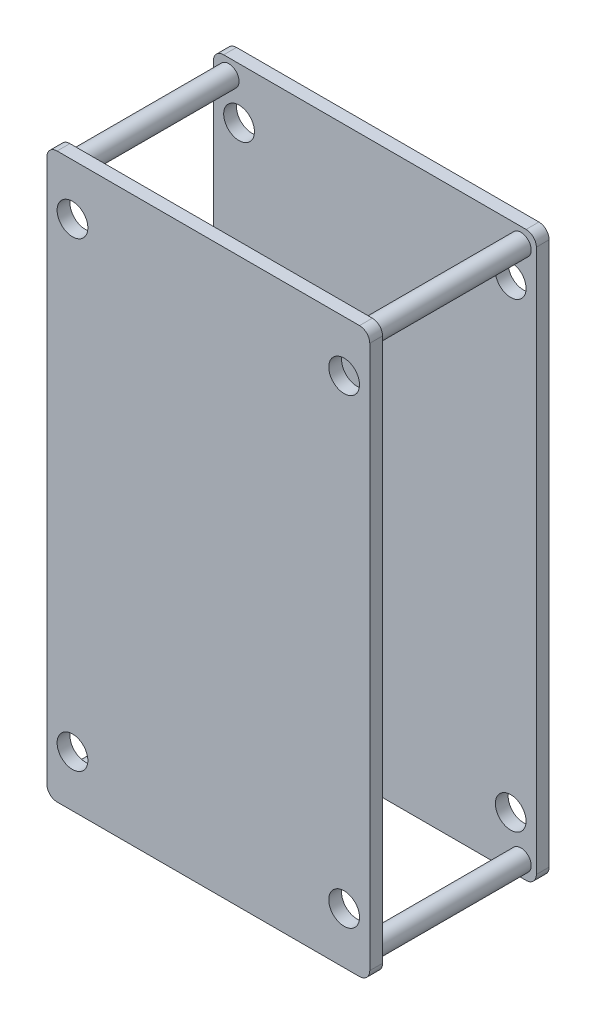
ISO-10303-21;
HEADER;
FILE_DESCRIPTION(('STEP AP214'),'2;1');
FILE_NAME('part.step','',(''),(''),'','','');
FILE_SCHEMA(('AUTOMOTIVE_DESIGN { 1 0 10303 214 1 1 1 1 }'));
ENDSEC;
DATA;
#1=APPLICATION_CONTEXT('core data for automotive mechanical design processes');
#2=APPLICATION_PROTOCOL_DEFINITION('international standard','automotive_design',2000,#1);
#3=PRODUCT_CONTEXT('',#1,'mechanical');
#4=PRODUCT('Part','Part','',(#3));
#5=PRODUCT_RELATED_PRODUCT_CATEGORY('part','',(#4));
#6=PRODUCT_DEFINITION_FORMATION('','',#4);
#7=PRODUCT_DEFINITION_CONTEXT('part definition',#1,'design');
#8=PRODUCT_DEFINITION('design','',#6,#7);
#9=PRODUCT_DEFINITION_SHAPE('','',#8);
#10=(LENGTH_UNIT() NAMED_UNIT(*) SI_UNIT(.MILLI.,.METRE.));
#11=(NAMED_UNIT(*) PLANE_ANGLE_UNIT() SI_UNIT($,.RADIAN.));
#12=(NAMED_UNIT(*) SI_UNIT($,.STERADIAN.) SOLID_ANGLE_UNIT());
#13=UNCERTAINTY_MEASURE_WITH_UNIT(LENGTH_MEASURE(1.E-05),#10,'distance_accuracy_value','');
#14=(GEOMETRIC_REPRESENTATION_CONTEXT(3) GLOBAL_UNCERTAINTY_ASSIGNED_CONTEXT((#13)) GLOBAL_UNIT_ASSIGNED_CONTEXT((#10,
#11,#12)) REPRESENTATION_CONTEXT('',''));
#15=CARTESIAN_POINT('',(0.,0.,0.));
#16=DIRECTION('',(0.,0.,1.));
#17=DIRECTION('',(1.,0.,0.));
#18=AXIS2_PLACEMENT_3D('',#15,#16,#17);
#19=CARTESIAN_POINT('',(-29.5,53.,35.));
#20=DIRECTION('',(0.,0.,1.));
#21=DIRECTION('',(1.,0.,0.));
#22=AXIS2_PLACEMENT_3D('',#19,#20,#21);
#23=CYLINDRICAL_SURFACE('',#22,2.);
#24=DIRECTION('',(0.,0.,1.));
#25=VECTOR('',#24,1.);
#26=CARTESIAN_POINT('',(-29.5,55.,35.));
#27=LINE('',#26,#25);
#28=CARTESIAN_POINT('',(-29.5,55.,32.5));
#29=VERTEX_POINT('',#28);
#30=CARTESIAN_POINT('',(-29.5,55.,35.));
#31=VERTEX_POINT('',#30);
#32=EDGE_CURVE('E261',#29,#31,#27,.T.);
#33=ORIENTED_EDGE('',*,*,#32,.F.);
#34=CARTESIAN_POINT('',(-29.5,53.,32.5));
#35=DIRECTION('',(0.,0.,-1.));
#36=DIRECTION('',(-1.,0.,0.));
#37=AXIS2_PLACEMENT_3D('',#34,#35,#36);
#38=CIRCLE('',#37,2.);
#39=CARTESIAN_POINT('',(-31.5,53.,32.5));
#40=VERTEX_POINT('',#39);
#41=EDGE_CURVE('E40',#40,#29,#38,.T.);
#42=ORIENTED_EDGE('',*,*,#41,.F.);
#43=DIRECTION('',(0.,0.,1.));
#44=VECTOR('',#43,1.);
#45=CARTESIAN_POINT('',(-31.5,53.,35.));
#46=LINE('',#45,#44);
#47=CARTESIAN_POINT('',(-31.5,53.,35.));
#48=VERTEX_POINT('',#47);
#49=EDGE_CURVE('E264',#48,#40,#46,.F.);
#50=ORIENTED_EDGE('',*,*,#49,.F.);
#51=CARTESIAN_POINT('',(-29.5,53.,35.));
#52=DIRECTION('',(0.,0.,-1.));
#53=DIRECTION('',(-1.,0.,0.));
#54=AXIS2_PLACEMENT_3D('',#51,#52,#53);
#55=CIRCLE('',#54,2.);
#56=EDGE_CURVE('E11',#31,#48,#55,.F.);
#57=ORIENTED_EDGE('',*,*,#56,.F.);
#58=EDGE_LOOP('',(#33,#42,#50,#57));
#59=FACE_BOUND('',#58,.T.);
#60=ADVANCED_FACE('F33',(#59),#23,.T.);
#61=CARTESIAN_POINT('',(-29.5,-53.,35.));
#62=DIRECTION('',(0.,0.,-1.));
#63=DIRECTION('',(-1.,0.,0.));
#64=AXIS2_PLACEMENT_3D('',#61,#62,#63);
#65=CYLINDRICAL_SURFACE('',#64,2.);
#66=DIRECTION('',(0.,0.,-1.));
#67=VECTOR('',#66,1.);
#68=CARTESIAN_POINT('',(-29.5,-55.,35.));
#69=LINE('',#68,#67);
#70=CARTESIAN_POINT('',(-29.5,-55.,35.));
#71=VERTEX_POINT('',#70);
#72=CARTESIAN_POINT('',(-29.5,-55.,32.5));
#73=VERTEX_POINT('',#72);
#74=EDGE_CURVE('E250',#71,#73,#69,.T.);
#75=ORIENTED_EDGE('',*,*,#74,.F.);
#76=CARTESIAN_POINT('',(-29.5,-53.,35.));
#77=DIRECTION('',(0.,0.,-1.));
#78=DIRECTION('',(-1.,0.,0.));
#79=AXIS2_PLACEMENT_3D('',#76,#77,#78);
#80=CIRCLE('',#79,2.);
#81=CARTESIAN_POINT('',(-31.5,-53.,35.));
#82=VERTEX_POINT('',#81);
#83=EDGE_CURVE('E256',#82,#71,#80,.F.);
#84=ORIENTED_EDGE('',*,*,#83,.F.);
#85=DIRECTION('',(0.,0.,-1.));
#86=VECTOR('',#85,1.);
#87=CARTESIAN_POINT('',(-31.5,-53.,35.));
#88=LINE('',#87,#86);
#89=CARTESIAN_POINT('',(-31.5,-53.,32.5));
#90=VERTEX_POINT('',#89);
#91=EDGE_CURVE('E253',#90,#82,#88,.F.);
#92=ORIENTED_EDGE('',*,*,#91,.F.);
#93=CARTESIAN_POINT('',(-29.5,-53.,32.5));
#94=DIRECTION('',(0.,0.,-1.));
#95=DIRECTION('',(-1.,0.,0.));
#96=AXIS2_PLACEMENT_3D('',#93,#94,#95);
#97=CIRCLE('',#96,2.);
#98=EDGE_CURVE('E258',#73,#90,#97,.T.);
#99=ORIENTED_EDGE('',*,*,#98,.F.);
#100=EDGE_LOOP('',(#75,#84,#92,#99));
#101=FACE_BOUND('',#100,.T.);
#102=ADVANCED_FACE('F358',(#101),#65,.T.);
#103=CARTESIAN_POINT('',(29.5,-53.,35.));
#104=DIRECTION('',(0.,0.,-1.));
#105=DIRECTION('',(-1.,0.,0.));
#106=AXIS2_PLACEMENT_3D('',#103,#104,#105);
#107=CYLINDRICAL_SURFACE('',#106,2.);
#108=DIRECTION('',(0.,0.,-1.));
#109=VECTOR('',#108,1.);
#110=CARTESIAN_POINT('',(31.5,-53.,35.));
#111=LINE('',#110,#109);
#112=CARTESIAN_POINT('',(31.5,-53.,35.));
#113=VERTEX_POINT('',#112);
#114=CARTESIAN_POINT('',(31.5,-53.,32.5));
#115=VERTEX_POINT('',#114);
#116=EDGE_CURVE('E239',#113,#115,#111,.T.);
#117=ORIENTED_EDGE('',*,*,#116,.F.);
#118=CARTESIAN_POINT('',(29.5,-53.,35.));
#119=DIRECTION('',(0.,0.,-1.));
#120=DIRECTION('',(-1.,0.,0.));
#121=AXIS2_PLACEMENT_3D('',#118,#119,#120);
#122=CIRCLE('',#121,2.);
#123=CARTESIAN_POINT('',(29.5,-55.,35.));
#124=VERTEX_POINT('',#123);
#125=EDGE_CURVE('E245',#124,#113,#122,.F.);
#126=ORIENTED_EDGE('',*,*,#125,.F.);
#127=DIRECTION('',(0.,0.,-1.));
#128=VECTOR('',#127,1.);
#129=CARTESIAN_POINT('',(29.5,-55.,35.));
#130=LINE('',#129,#128);
#131=CARTESIAN_POINT('',(29.5,-55.,32.5));
#132=VERTEX_POINT('',#131);
#133=EDGE_CURVE('E242',#132,#124,#130,.F.);
#134=ORIENTED_EDGE('',*,*,#133,.F.);
#135=CARTESIAN_POINT('',(29.5,-53.,32.5));
#136=DIRECTION('',(0.,0.,-1.));
#137=DIRECTION('',(-1.,0.,0.));
#138=AXIS2_PLACEMENT_3D('',#135,#136,#137);
#139=CIRCLE('',#138,2.);
#140=EDGE_CURVE('E247',#115,#132,#139,.T.);
#141=ORIENTED_EDGE('',*,*,#140,.F.);
#142=EDGE_LOOP('',(#117,#126,#134,#141));
#143=FACE_BOUND('',#142,.T.);
#144=ADVANCED_FACE('F362',(#143),#107,.T.);
#145=CARTESIAN_POINT('',(29.5,53.,35.));
#146=DIRECTION('',(0.,0.,1.));
#147=DIRECTION('',(1.,0.,0.));
#148=AXIS2_PLACEMENT_3D('',#145,#146,#147);
#149=CYLINDRICAL_SURFACE('',#148,2.);
#150=DIRECTION('',(0.,0.,1.));
#151=VECTOR('',#150,1.);
#152=CARTESIAN_POINT('',(31.5,53.,35.));
#153=LINE('',#152,#151);
#154=CARTESIAN_POINT('',(31.5,53.,32.5));
#155=VERTEX_POINT('',#154);
#156=CARTESIAN_POINT('',(31.5,53.,35.));
#157=VERTEX_POINT('',#156);
#158=EDGE_CURVE('E228',#155,#157,#153,.T.);
#159=ORIENTED_EDGE('',*,*,#158,.F.);
#160=CARTESIAN_POINT('',(29.5,53.,32.5));
#161=DIRECTION('',(0.,0.,-1.));
#162=DIRECTION('',(-1.,0.,0.));
#163=AXIS2_PLACEMENT_3D('',#160,#161,#162);
#164=CIRCLE('',#163,2.);
#165=CARTESIAN_POINT('',(29.5,55.,32.5));
#166=VERTEX_POINT('',#165);
#167=EDGE_CURVE('E234',#166,#155,#164,.T.);
#168=ORIENTED_EDGE('',*,*,#167,.F.);
#169=DIRECTION('',(0.,0.,1.));
#170=VECTOR('',#169,1.);
#171=CARTESIAN_POINT('',(29.5,55.,35.));
#172=LINE('',#171,#170);
#173=CARTESIAN_POINT('',(29.5,55.,35.));
#174=VERTEX_POINT('',#173);
#175=EDGE_CURVE('E231',#174,#166,#172,.F.);
#176=ORIENTED_EDGE('',*,*,#175,.F.);
#177=CARTESIAN_POINT('',(29.5,53.,35.));
#178=DIRECTION('',(0.,0.,-1.));
#179=DIRECTION('',(-1.,0.,0.));
#180=AXIS2_PLACEMENT_3D('',#177,#178,#179);
#181=CIRCLE('',#180,2.);
#182=EDGE_CURVE('E237',#157,#174,#181,.F.);
#183=ORIENTED_EDGE('',*,*,#182,.F.);
#184=EDGE_LOOP('',(#159,#168,#176,#183));
#185=FACE_BOUND('',#184,.T.);
#186=ADVANCED_FACE('F367',(#185),#149,.T.);
#187=CARTESIAN_POINT('',(-29.5,-53.,2.5));
#188=DIRECTION('',(0.,0.,1.));
#189=DIRECTION('',(1.,0.,0.));
#190=AXIS2_PLACEMENT_3D('',#187,#188,#189);
#191=CYLINDRICAL_SURFACE('',#190,2.);
#192=DIRECTION('',(0.,0.,1.));
#193=VECTOR('',#192,1.);
#194=CARTESIAN_POINT('',(-31.5,-53.,2.5));
#195=LINE('',#194,#193);
#196=CARTESIAN_POINT('',(-31.5,-53.,0.));
#197=VERTEX_POINT('',#196);
#198=CARTESIAN_POINT('',(-31.5,-53.,2.5));
#199=VERTEX_POINT('',#198);
#200=EDGE_CURVE('E218',#197,#199,#195,.T.);
#201=ORIENTED_EDGE('',*,*,#200,.F.);
#202=CARTESIAN_POINT('',(-29.5,-53.,0.));
#203=DIRECTION('',(0.,0.,-1.));
#204=DIRECTION('',(-1.,0.,0.));
#205=AXIS2_PLACEMENT_3D('',#202,#203,#204);
#206=CIRCLE('',#205,2.);
#207=CARTESIAN_POINT('',(-29.5,-55.,0.));
#208=VERTEX_POINT('',#207);
#209=EDGE_CURVE('E224',#208,#197,#206,.T.);
#210=ORIENTED_EDGE('',*,*,#209,.F.);
#211=DIRECTION('',(0.,0.,1.));
#212=VECTOR('',#211,1.);
#213=CARTESIAN_POINT('',(-29.5,-55.,2.5));
#214=LINE('',#213,#212);
#215=CARTESIAN_POINT('',(-29.5,-55.,2.5));
#216=VERTEX_POINT('',#215);
#217=EDGE_CURVE('E221',#216,#208,#214,.F.);
#218=ORIENTED_EDGE('',*,*,#217,.F.);
#219=CARTESIAN_POINT('',(-29.5,-53.,2.5));
#220=DIRECTION('',(0.,0.,-1.));
#221=DIRECTION('',(-1.,0.,0.));
#222=AXIS2_PLACEMENT_3D('',#219,#220,#221);
#223=CIRCLE('',#222,2.);
#224=EDGE_CURVE('E226',#199,#216,#223,.F.);
#225=ORIENTED_EDGE('',*,*,#224,.F.);
#226=EDGE_LOOP('',(#201,#210,#218,#225));
#227=FACE_BOUND('',#226,.T.);
#228=ADVANCED_FACE('F336',(#227),#191,.T.);
#229=CARTESIAN_POINT('',(-29.5,53.,2.5));
#230=DIRECTION('',(0.,0.,1.));
#231=DIRECTION('',(1.,0.,0.));
#232=AXIS2_PLACEMENT_3D('',#229,#230,#231);
#233=CYLINDRICAL_SURFACE('',#232,2.);
#234=DIRECTION('',(0.,0.,1.));
#235=VECTOR('',#234,1.);
#236=CARTESIAN_POINT('',(-29.5,55.,2.5));
#237=LINE('',#236,#235);
#238=CARTESIAN_POINT('',(-29.5,55.,0.));
#239=VERTEX_POINT('',#238);
#240=CARTESIAN_POINT('',(-29.5,55.,2.5));
#241=VERTEX_POINT('',#240);
#242=EDGE_CURVE('E208',#239,#241,#237,.T.);
#243=ORIENTED_EDGE('',*,*,#242,.F.);
#244=CARTESIAN_POINT('',(-29.5,53.,0.));
#245=DIRECTION('',(0.,0.,-1.));
#246=DIRECTION('',(-1.,0.,0.));
#247=AXIS2_PLACEMENT_3D('',#244,#245,#246);
#248=CIRCLE('',#247,2.);
#249=CARTESIAN_POINT('',(-31.5,53.,0.));
#250=VERTEX_POINT('',#249);
#251=EDGE_CURVE('E214',#250,#239,#248,.T.);
#252=ORIENTED_EDGE('',*,*,#251,.F.);
#253=DIRECTION('',(0.,0.,1.));
#254=VECTOR('',#253,1.);
#255=CARTESIAN_POINT('',(-31.5,53.,2.5));
#256=LINE('',#255,#254);
#257=CARTESIAN_POINT('',(-31.5,53.,2.5));
#258=VERTEX_POINT('',#257);
#259=EDGE_CURVE('E211',#258,#250,#256,.F.);
#260=ORIENTED_EDGE('',*,*,#259,.F.);
#261=CARTESIAN_POINT('',(-29.5,53.,2.5));
#262=DIRECTION('',(0.,0.,-1.));
#263=DIRECTION('',(-1.,0.,0.));
#264=AXIS2_PLACEMENT_3D('',#261,#262,#263);
#265=CIRCLE('',#264,2.);
#266=EDGE_CURVE('E216',#241,#258,#265,.F.);
#267=ORIENTED_EDGE('',*,*,#266,.F.);
#268=EDGE_LOOP('',(#243,#252,#260,#267));
#269=FACE_BOUND('',#268,.T.);
#270=ADVANCED_FACE('F342',(#269),#233,.T.);
#271=CARTESIAN_POINT('',(29.5,53.,2.5));
#272=DIRECTION('',(0.,0.,1.));
#273=DIRECTION('',(1.,0.,0.));
#274=AXIS2_PLACEMENT_3D('',#271,#272,#273);
#275=CYLINDRICAL_SURFACE('',#274,2.);
#276=DIRECTION('',(0.,0.,1.));
#277=VECTOR('',#276,1.);
#278=CARTESIAN_POINT('',(31.5,53.,2.5));
#279=LINE('',#278,#277);
#280=CARTESIAN_POINT('',(31.5,53.,0.));
#281=VERTEX_POINT('',#280);
#282=CARTESIAN_POINT('',(31.5,53.,2.5));
#283=VERTEX_POINT('',#282);
#284=EDGE_CURVE('E154',#281,#283,#279,.T.);
#285=ORIENTED_EDGE('',*,*,#284,.F.);
#286=CARTESIAN_POINT('',(29.5,53.,0.));
#287=DIRECTION('',(0.,0.,-1.));
#288=DIRECTION('',(-1.,0.,0.));
#289=AXIS2_PLACEMENT_3D('',#286,#287,#288);
#290=CIRCLE('',#289,2.);
#291=CARTESIAN_POINT('',(29.5,55.,0.));
#292=VERTEX_POINT('',#291);
#293=EDGE_CURVE('E169',#292,#281,#290,.T.);
#294=ORIENTED_EDGE('',*,*,#293,.F.);
#295=DIRECTION('',(0.,0.,1.));
#296=VECTOR('',#295,1.);
#297=CARTESIAN_POINT('',(29.5,55.,2.5));
#298=LINE('',#297,#296);
#299=CARTESIAN_POINT('',(29.5,55.,2.5));
#300=VERTEX_POINT('',#299);
#301=EDGE_CURVE('E202',#300,#292,#298,.F.);
#302=ORIENTED_EDGE('',*,*,#301,.F.);
#303=CARTESIAN_POINT('',(29.5,53.,2.5));
#304=DIRECTION('',(0.,0.,-1.));
#305=DIRECTION('',(-1.,0.,0.));
#306=AXIS2_PLACEMENT_3D('',#303,#304,#305);
#307=CIRCLE('',#306,2.);
#308=EDGE_CURVE('E206',#283,#300,#307,.F.);
#309=ORIENTED_EDGE('',*,*,#308,.F.);
#310=EDGE_LOOP('',(#285,#294,#302,#309));
#311=FACE_BOUND('',#310,.T.);
#312=ADVANCED_FACE('F348',(#311),#275,.T.);
#313=CARTESIAN_POINT('',(29.5,-53.,2.5));
#314=DIRECTION('',(0.,0.,-1.));
#315=DIRECTION('',(-1.,0.,0.));
#316=AXIS2_PLACEMENT_3D('',#313,#314,#315);
#317=CYLINDRICAL_SURFACE('',#316,2.);
#318=DIRECTION('',(0.,0.,-1.));
#319=VECTOR('',#318,1.);
#320=CARTESIAN_POINT('',(31.5,-53.,2.5));
#321=LINE('',#320,#319);
#322=CARTESIAN_POINT('',(31.5,-53.,2.5));
#323=VERTEX_POINT('',#322);
#324=CARTESIAN_POINT('',(31.5,-53.,0.));
#325=VERTEX_POINT('',#324);
#326=EDGE_CURVE('E147',#323,#325,#321,.T.);
#327=ORIENTED_EDGE('',*,*,#326,.F.);
#328=CARTESIAN_POINT('',(29.5,-53.,2.5));
#329=DIRECTION('',(0.,0.,-1.));
#330=DIRECTION('',(-1.,0.,0.));
#331=AXIS2_PLACEMENT_3D('',#328,#329,#330);
#332=CIRCLE('',#331,2.);
#333=CARTESIAN_POINT('',(29.5,-55.,2.5));
#334=VERTEX_POINT('',#333);
#335=EDGE_CURVE('E155',#334,#323,#332,.F.);
#336=ORIENTED_EDGE('',*,*,#335,.F.);
#337=DIRECTION('',(0.,0.,-1.));
#338=VECTOR('',#337,1.);
#339=CARTESIAN_POINT('',(29.5,-55.,2.5));
#340=LINE('',#339,#338);
#341=CARTESIAN_POINT('',(29.5,-55.,0.));
#342=VERTEX_POINT('',#341);
#343=EDGE_CURVE('E150',#342,#334,#340,.F.);
#344=ORIENTED_EDGE('',*,*,#343,.F.);
#345=CARTESIAN_POINT('',(29.5,-53.,0.));
#346=DIRECTION('',(0.,0.,-1.));
#347=DIRECTION('',(-1.,0.,0.));
#348=AXIS2_PLACEMENT_3D('',#345,#346,#347);
#349=CIRCLE('',#348,2.);
#350=EDGE_CURVE('E143',#325,#342,#349,.T.);
#351=ORIENTED_EDGE('',*,*,#350,.F.);
#352=EDGE_LOOP('',(#327,#336,#344,#351));
#353=FACE_BOUND('',#352,.T.);
#354=ADVANCED_FACE('F145',(#353),#317,.T.);
#355=CARTESIAN_POINT('',(0.,0.,2.5));
#356=DIRECTION('',(0.,0.,-1.));
#357=DIRECTION('',(-1.,0.,0.));
#358=AXIS2_PLACEMENT_3D('',#355,#356,#357);
#359=PLANE('',#358);
#360=CARTESIAN_POINT('',(-28.5,-52.,2.5));
#361=DIRECTION('',(0.,0.,-1.));
#362=DIRECTION('',(-1.,0.,0.));
#363=AXIS2_PLACEMENT_3D('',#360,#361,#362);
#364=CIRCLE('',#363,2.);
#365=CARTESIAN_POINT('',(-30.5,-52.,2.5));
#366=VERTEX_POINT('',#365);
#367=EDGE_CURVE('E164',#366,#366,#364,.F.);
#368=ORIENTED_EDGE('',*,*,#367,.F.);
#369=EDGE_LOOP('',(#368));
#370=FACE_BOUND('',#369,.T.);
#371=CARTESIAN_POINT('',(28.5,-52.,2.5));
#372=DIRECTION('',(0.,0.,-1.));
#373=DIRECTION('',(-1.,0.,0.));
#374=AXIS2_PLACEMENT_3D('',#371,#372,#373);
#375=CIRCLE('',#374,2.);
#376=CARTESIAN_POINT('',(26.5,-52.,2.5));
#377=VERTEX_POINT('',#376);
#378=EDGE_CURVE('E194',#377,#377,#375,.F.);
#379=ORIENTED_EDGE('',*,*,#378,.F.);
#380=EDGE_LOOP('',(#379));
#381=FACE_BOUND('',#380,.T.);
#382=CARTESIAN_POINT('',(28.5,52.,2.5));
#383=DIRECTION('',(0.,0.,-1.));
#384=DIRECTION('',(-1.,0.,0.));
#385=AXIS2_PLACEMENT_3D('',#382,#383,#384);
#386=CIRCLE('',#385,2.);
#387=CARTESIAN_POINT('',(26.5,52.,2.5));
#388=VERTEX_POINT('',#387);
#389=EDGE_CURVE('E191',#388,#388,#386,.F.);
#390=ORIENTED_EDGE('',*,*,#389,.F.);
#391=EDGE_LOOP('',(#390));
#392=FACE_BOUND('',#391,.T.);
#393=CARTESIAN_POINT('',(-28.5,52.,2.5));
#394=DIRECTION('',(0.,0.,-1.));
#395=DIRECTION('',(-1.,0.,0.));
#396=AXIS2_PLACEMENT_3D('',#393,#394,#395);
#397=CIRCLE('',#396,2.);
#398=CARTESIAN_POINT('',(-30.5,52.,2.5));
#399=VERTEX_POINT('',#398);
#400=EDGE_CURVE('E188',#399,#399,#397,.F.);
#401=ORIENTED_EDGE('',*,*,#400,.F.);
#402=EDGE_LOOP('',(#401));
#403=FACE_BOUND('',#402,.T.);
#404=DIRECTION('',(0.,-1.,0.));
#405=VECTOR('',#404,1.);
#406=CARTESIAN_POINT('',(-31.5,-55.,2.5));
#407=LINE('',#406,#405);
#408=EDGE_CURVE('E323',#258,#199,#407,.T.);
#409=ORIENTED_EDGE('',*,*,#408,.T.);
#410=ORIENTED_EDGE('',*,*,#224,.T.);
#411=DIRECTION('',(1.,0.,0.));
#412=VECTOR('',#411,1.);
#413=CARTESIAN_POINT('',(-31.5,-55.,2.5));
#414=LINE('',#413,#412);
#415=EDGE_CURVE('E181',#216,#334,#414,.T.);
#416=ORIENTED_EDGE('',*,*,#415,.T.);
#417=ORIENTED_EDGE('',*,*,#335,.T.);
#418=DIRECTION('',(0.,1.,0.));
#419=VECTOR('',#418,1.);
#420=CARTESIAN_POINT('',(31.5,-55.,2.5));
#421=LINE('',#420,#419);
#422=EDGE_CURVE('E163',#323,#283,#421,.T.);
#423=ORIENTED_EDGE('',*,*,#422,.T.);
#424=ORIENTED_EDGE('',*,*,#308,.T.);
#425=DIRECTION('',(-1.,0.,0.));
#426=VECTOR('',#425,1.);
#427=CARTESIAN_POINT('',(-31.5,55.,2.5));
#428=LINE('',#427,#426);
#429=EDGE_CURVE('E321',#300,#241,#428,.T.);
#430=ORIENTED_EDGE('',*,*,#429,.T.);
#431=ORIENTED_EDGE('',*,*,#266,.T.);
#432=EDGE_LOOP('',(#409,#410,#416,#417,#423,#424,#430,#431));
#433=FACE_BOUND('',#432,.T.);
#434=CARTESIAN_POINT('',(-26.5,45.,2.5));
#435=DIRECTION('',(0.,0.,1.));
#436=DIRECTION('',(1.,0.,0.));
#437=AXIS2_PLACEMENT_3D('',#434,#435,#436);
#438=CIRCLE('',#437,3.);
#439=CARTESIAN_POINT('',(-23.5,45.,2.5));
#440=VERTEX_POINT('',#439);
#441=EDGE_CURVE('E172',#440,#440,#438,.T.);
#442=ORIENTED_EDGE('',*,*,#441,.F.);
#443=EDGE_LOOP('',(#442));
#444=FACE_BOUND('',#443,.T.);
#445=CARTESIAN_POINT('',(-26.5,-45.,2.5));
#446=DIRECTION('',(0.,0.,1.));
#447=DIRECTION('',(1.,0.,0.));
#448=AXIS2_PLACEMENT_3D('',#445,#446,#447);
#449=CIRCLE('',#448,3.);
#450=CARTESIAN_POINT('',(-23.5,-45.,2.5));
#451=VERTEX_POINT('',#450);
#452=EDGE_CURVE('E313',#451,#451,#449,.T.);
#453=ORIENTED_EDGE('',*,*,#452,.F.);
#454=EDGE_LOOP('',(#453));
#455=FACE_BOUND('',#454,.T.);
#456=CARTESIAN_POINT('',(26.5,-45.,2.5));
#457=DIRECTION('',(0.,0.,1.));
#458=DIRECTION('',(1.,0.,0.));
#459=AXIS2_PLACEMENT_3D('',#456,#457,#458);
#460=CIRCLE('',#459,3.);
#461=CARTESIAN_POINT('',(29.5,-45.,2.5));
#462=VERTEX_POINT('',#461);
#463=EDGE_CURVE('E307',#462,#462,#460,.T.);
#464=ORIENTED_EDGE('',*,*,#463,.F.);
#465=EDGE_LOOP('',(#464));
#466=FACE_BOUND('',#465,.T.);
#467=CARTESIAN_POINT('',(26.5,45.,2.5));
#468=DIRECTION('',(0.,0.,1.));
#469=DIRECTION('',(1.,0.,0.));
#470=AXIS2_PLACEMENT_3D('',#467,#468,#469);
#471=CIRCLE('',#470,3.);
#472=CARTESIAN_POINT('',(29.5,45.,2.5));
#473=VERTEX_POINT('',#472);
#474=EDGE_CURVE('E301',#473,#473,#471,.T.);
#475=ORIENTED_EDGE('',*,*,#474,.F.);
#476=EDGE_LOOP('',(#475));
#477=FACE_BOUND('',#476,.T.);
#478=ADVANCED_FACE('F328',(#370,#381,#392,#403,#433,#444,#455,#466,#477),#359,.F.);
#479=CARTESIAN_POINT('',(0.,0.,0.));
#480=DIRECTION('',(0.,0.,-1.));
#481=DIRECTION('',(-1.,0.,0.));
#482=AXIS2_PLACEMENT_3D('',#479,#480,#481);
#483=PLANE('',#482);
#484=CARTESIAN_POINT('',(26.5,-45.,0.));
#485=DIRECTION('',(0.,0.,1.));
#486=DIRECTION('',(1.,0.,0.));
#487=AXIS2_PLACEMENT_3D('',#484,#485,#486);
#488=CIRCLE('',#487,3.);
#489=CARTESIAN_POINT('',(29.5,-45.,0.));
#490=VERTEX_POINT('',#489);
#491=EDGE_CURVE('E304',#490,#490,#488,.T.);
#492=ORIENTED_EDGE('',*,*,#491,.T.);
#493=EDGE_LOOP('',(#492));
#494=FACE_BOUND('',#493,.T.);
#495=CARTESIAN_POINT('',(-26.5,45.,0.));
#496=DIRECTION('',(0.,0.,1.));
#497=DIRECTION('',(1.,0.,0.));
#498=AXIS2_PLACEMENT_3D('',#495,#496,#497);
#499=CIRCLE('',#498,3.);
#500=CARTESIAN_POINT('',(-23.5,45.,0.));
#501=VERTEX_POINT('',#500);
#502=EDGE_CURVE('E178',#501,#501,#499,.T.);
#503=ORIENTED_EDGE('',*,*,#502,.T.);
#504=EDGE_LOOP('',(#503));
#505=FACE_BOUND('',#504,.T.);
#506=DIRECTION('',(1.,0.,0.));
#507=VECTOR('',#506,1.);
#508=CARTESIAN_POINT('',(-31.5,-55.,0.));
#509=LINE('',#508,#507);
#510=EDGE_CURVE('E186',#208,#342,#509,.T.);
#511=ORIENTED_EDGE('',*,*,#510,.F.);
#512=ORIENTED_EDGE('',*,*,#209,.T.);
#513=DIRECTION('',(0.,-1.,0.));
#514=VECTOR('',#513,1.);
#515=CARTESIAN_POINT('',(-31.5,-55.,0.));
#516=LINE('',#515,#514);
#517=EDGE_CURVE('E175',#250,#197,#516,.T.);
#518=ORIENTED_EDGE('',*,*,#517,.F.);
#519=ORIENTED_EDGE('',*,*,#251,.T.);
#520=DIRECTION('',(-1.,0.,0.));
#521=VECTOR('',#520,1.);
#522=CARTESIAN_POINT('',(-31.5,55.,0.));
#523=LINE('',#522,#521);
#524=EDGE_CURVE('E171',#292,#239,#523,.T.);
#525=ORIENTED_EDGE('',*,*,#524,.F.);
#526=ORIENTED_EDGE('',*,*,#293,.T.);
#527=DIRECTION('',(0.,1.,0.));
#528=VECTOR('',#527,1.);
#529=CARTESIAN_POINT('',(31.5,-55.,0.));
#530=LINE('',#529,#528);
#531=EDGE_CURVE('E161',#325,#281,#530,.T.);
#532=ORIENTED_EDGE('',*,*,#531,.F.);
#533=ORIENTED_EDGE('',*,*,#350,.T.);
#534=EDGE_LOOP('',(#511,#512,#518,#519,#525,#526,#532,#533));
#535=FACE_BOUND('',#534,.T.);
#536=CARTESIAN_POINT('',(-26.5,-45.,0.));
#537=DIRECTION('',(0.,0.,1.));
#538=DIRECTION('',(1.,0.,0.));
#539=AXIS2_PLACEMENT_3D('',#536,#537,#538);
#540=CIRCLE('',#539,3.);
#541=CARTESIAN_POINT('',(-23.5,-45.,0.));
#542=VERTEX_POINT('',#541);
#543=EDGE_CURVE('E310',#542,#542,#540,.T.);
#544=ORIENTED_EDGE('',*,*,#543,.T.);
#545=EDGE_LOOP('',(#544));
#546=FACE_BOUND('',#545,.T.);
#547=CARTESIAN_POINT('',(26.5,45.,0.));
#548=DIRECTION('',(0.,0.,1.));
#549=DIRECTION('',(1.,0.,0.));
#550=AXIS2_PLACEMENT_3D('',#547,#548,#549);
#551=CIRCLE('',#550,3.);
#552=CARTESIAN_POINT('',(29.5,45.,0.));
#553=VERTEX_POINT('',#552);
#554=EDGE_CURVE('E300',#553,#553,#551,.T.);
#555=ORIENTED_EDGE('',*,*,#554,.T.);
#556=EDGE_LOOP('',(#555));
#557=FACE_BOUND('',#556,.T.);
#558=ADVANCED_FACE('F166',(#494,#505,#535,#546,#557),#483,.T.);
#559=CARTESIAN_POINT('',(31.5,-55.,2.5));
#560=DIRECTION('',(-1.,0.,0.));
#561=DIRECTION('',(0.,0.,1.));
#562=AXIS2_PLACEMENT_3D('',#559,#560,#561);
#563=PLANE('',#562);
#564=ORIENTED_EDGE('',*,*,#531,.T.);
#565=ORIENTED_EDGE('',*,*,#284,.T.);
#566=ORIENTED_EDGE('',*,*,#422,.F.);
#567=ORIENTED_EDGE('',*,*,#326,.T.);
#568=EDGE_LOOP('',(#564,#565,#566,#567));
#569=FACE_BOUND('',#568,.T.);
#570=ADVANCED_FACE('F159',(#569),#563,.F.);
#571=CARTESIAN_POINT('',(-31.5,55.,2.5));
#572=DIRECTION('',(0.,-1.,0.));
#573=DIRECTION('',(0.,0.,-1.));
#574=AXIS2_PLACEMENT_3D('',#571,#572,#573);
#575=PLANE('',#574);
#576=ORIENTED_EDGE('',*,*,#524,.T.);
#577=ORIENTED_EDGE('',*,*,#242,.T.);
#578=ORIENTED_EDGE('',*,*,#429,.F.);
#579=ORIENTED_EDGE('',*,*,#301,.T.);
#580=EDGE_LOOP('',(#576,#577,#578,#579));
#581=FACE_BOUND('',#580,.T.);
#582=ADVANCED_FACE('F344',(#581),#575,.F.);
#583=CARTESIAN_POINT('',(-31.5,-55.,2.5));
#584=DIRECTION('',(1.,0.,0.));
#585=DIRECTION('',(0.,0.,-1.));
#586=AXIS2_PLACEMENT_3D('',#583,#584,#585);
#587=PLANE('',#586);
#588=ORIENTED_EDGE('',*,*,#517,.T.);
#589=ORIENTED_EDGE('',*,*,#200,.T.);
#590=ORIENTED_EDGE('',*,*,#408,.F.);
#591=ORIENTED_EDGE('',*,*,#259,.T.);
#592=EDGE_LOOP('',(#588,#589,#590,#591));
#593=FACE_BOUND('',#592,.T.);
#594=ADVANCED_FACE('F338',(#593),#587,.F.);
#595=CARTESIAN_POINT('',(-31.5,-55.,2.5));
#596=DIRECTION('',(0.,1.,0.));
#597=DIRECTION('',(0.,0.,1.));
#598=AXIS2_PLACEMENT_3D('',#595,#596,#597);
#599=PLANE('',#598);
#600=ORIENTED_EDGE('',*,*,#415,.F.);
#601=ORIENTED_EDGE('',*,*,#217,.T.);
#602=ORIENTED_EDGE('',*,*,#510,.T.);
#603=ORIENTED_EDGE('',*,*,#343,.T.);
#604=EDGE_LOOP('',(#600,#601,#602,#603));
#605=FACE_BOUND('',#604,.T.);
#606=ADVANCED_FACE('F332',(#605),#599,.F.);
#607=CARTESIAN_POINT('',(-26.5,45.,2.5));
#608=DIRECTION('',(0.,0.,-1.));
#609=DIRECTION('',(-1.,0.,0.));
#610=AXIS2_PLACEMENT_3D('',#607,#608,#609);
#611=CYLINDRICAL_SURFACE('',#610,3.);
#612=ORIENTED_EDGE('',*,*,#441,.T.);
#613=EDGE_LOOP('',(#612));
#614=FACE_BOUND('',#613,.T.);
#615=ORIENTED_EDGE('',*,*,#502,.F.);
#616=EDGE_LOOP('',(#615));
#617=FACE_BOUND('',#616,.T.);
#618=ADVANCED_FACE('F415',(#614,#617),#611,.F.);
#619=CARTESIAN_POINT('',(-26.5,-45.,2.5));
#620=DIRECTION('',(0.,0.,-1.));
#621=DIRECTION('',(-1.,0.,0.));
#622=AXIS2_PLACEMENT_3D('',#619,#620,#621);
#623=CYLINDRICAL_SURFACE('',#622,3.);
#624=ORIENTED_EDGE('',*,*,#452,.T.);
#625=EDGE_LOOP('',(#624));
#626=FACE_BOUND('',#625,.T.);
#627=ORIENTED_EDGE('',*,*,#543,.F.);
#628=EDGE_LOOP('',(#627));
#629=FACE_BOUND('',#628,.T.);
#630=ADVANCED_FACE('F423',(#626,#629),#623,.F.);
#631=CARTESIAN_POINT('',(26.5,-45.,2.5));
#632=DIRECTION('',(0.,0.,-1.));
#633=DIRECTION('',(-1.,0.,0.));
#634=AXIS2_PLACEMENT_3D('',#631,#632,#633);
#635=CYLINDRICAL_SURFACE('',#634,3.);
#636=ORIENTED_EDGE('',*,*,#463,.T.);
#637=EDGE_LOOP('',(#636));
#638=FACE_BOUND('',#637,.T.);
#639=ORIENTED_EDGE('',*,*,#491,.F.);
#640=EDGE_LOOP('',(#639));
#641=FACE_BOUND('',#640,.T.);
#642=ADVANCED_FACE('F431',(#638,#641),#635,.F.);
#643=CARTESIAN_POINT('',(26.5,45.,2.5));
#644=DIRECTION('',(0.,0.,-1.));
#645=DIRECTION('',(-1.,0.,0.));
#646=AXIS2_PLACEMENT_3D('',#643,#644,#645);
#647=CYLINDRICAL_SURFACE('',#646,3.);
#648=ORIENTED_EDGE('',*,*,#474,.T.);
#649=EDGE_LOOP('',(#648));
#650=FACE_BOUND('',#649,.T.);
#651=ORIENTED_EDGE('',*,*,#554,.F.);
#652=EDGE_LOOP('',(#651));
#653=FACE_BOUND('',#652,.T.);
#654=ADVANCED_FACE('F439',(#650,#653),#647,.F.);
#655=CARTESIAN_POINT('',(-28.5,52.,32.5));
#656=DIRECTION('',(0.,0.,-1.));
#657=DIRECTION('',(-1.,0.,0.));
#658=AXIS2_PLACEMENT_3D('',#655,#656,#657);
#659=CYLINDRICAL_SURFACE('',#658,2.);
#660=CARTESIAN_POINT('',(-28.5,52.,32.5));
#661=DIRECTION('',(0.,0.,1.));
#662=DIRECTION('',(1.,0.,0.));
#663=AXIS2_PLACEMENT_3D('',#660,#661,#662);
#664=CIRCLE('',#663,2.);
#665=CARTESIAN_POINT('',(-26.5,52.,32.5));
#666=VERTEX_POINT('',#665);
#667=EDGE_CURVE('E297',#666,#666,#664,.T.);
#668=ORIENTED_EDGE('',*,*,#667,.F.);
#669=EDGE_LOOP('',(#668));
#670=FACE_BOUND('',#669,.T.);
#671=ORIENTED_EDGE('',*,*,#400,.T.);
#672=EDGE_LOOP('',(#671));
#673=FACE_BOUND('',#672,.T.);
#674=ADVANCED_FACE('F447',(#670,#673),#659,.T.);
#675=CARTESIAN_POINT('',(28.5,52.,32.5));
#676=DIRECTION('',(0.,0.,-1.));
#677=DIRECTION('',(-1.,0.,0.));
#678=AXIS2_PLACEMENT_3D('',#675,#676,#677);
#679=CYLINDRICAL_SURFACE('',#678,2.);
#680=CARTESIAN_POINT('',(28.5,52.,32.5));
#681=DIRECTION('',(0.,0.,1.));
#682=DIRECTION('',(1.,0.,0.));
#683=AXIS2_PLACEMENT_3D('',#680,#681,#682);
#684=CIRCLE('',#683,2.);
#685=CARTESIAN_POINT('',(30.5,52.,32.5));
#686=VERTEX_POINT('',#685);
#687=EDGE_CURVE('E294',#686,#686,#684,.T.);
#688=ORIENTED_EDGE('',*,*,#687,.F.);
#689=EDGE_LOOP('',(#688));
#690=FACE_BOUND('',#689,.T.);
#691=ORIENTED_EDGE('',*,*,#389,.T.);
#692=EDGE_LOOP('',(#691));
#693=FACE_BOUND('',#692,.T.);
#694=ADVANCED_FACE('F455',(#690,#693),#679,.T.);
#695=CARTESIAN_POINT('',(28.5,-52.,32.5));
#696=DIRECTION('',(0.,0.,-1.));
#697=DIRECTION('',(-1.,0.,0.));
#698=AXIS2_PLACEMENT_3D('',#695,#696,#697);
#699=CYLINDRICAL_SURFACE('',#698,2.);
#700=CARTESIAN_POINT('',(28.5,-52.,32.5));
#701=DIRECTION('',(0.,0.,1.));
#702=DIRECTION('',(1.,0.,0.));
#703=AXIS2_PLACEMENT_3D('',#700,#701,#702);
#704=CIRCLE('',#703,2.);
#705=CARTESIAN_POINT('',(30.5,-52.,32.5));
#706=VERTEX_POINT('',#705);
#707=EDGE_CURVE('E290',#706,#706,#704,.T.);
#708=ORIENTED_EDGE('',*,*,#707,.F.);
#709=EDGE_LOOP('',(#708));
#710=FACE_BOUND('',#709,.T.);
#711=ORIENTED_EDGE('',*,*,#378,.T.);
#712=EDGE_LOOP('',(#711));
#713=FACE_BOUND('',#712,.T.);
#714=ADVANCED_FACE('F463',(#710,#713),#699,.T.);
#715=CARTESIAN_POINT('',(-28.5,-52.,32.5));
#716=DIRECTION('',(0.,0.,-1.));
#717=DIRECTION('',(-1.,0.,0.));
#718=AXIS2_PLACEMENT_3D('',#715,#716,#717);
#719=CYLINDRICAL_SURFACE('',#718,2.);
#720=CARTESIAN_POINT('',(-28.5,-52.,32.5));
#721=DIRECTION('',(0.,0.,1.));
#722=DIRECTION('',(1.,0.,0.));
#723=AXIS2_PLACEMENT_3D('',#720,#721,#722);
#724=CIRCLE('',#723,2.);
#725=CARTESIAN_POINT('',(-26.5,-52.,32.5));
#726=VERTEX_POINT('',#725);
#727=EDGE_CURVE('E287',#726,#726,#724,.T.);
#728=ORIENTED_EDGE('',*,*,#727,.F.);
#729=EDGE_LOOP('',(#728));
#730=FACE_BOUND('',#729,.T.);
#731=ORIENTED_EDGE('',*,*,#367,.T.);
#732=EDGE_LOOP('',(#731));
#733=FACE_BOUND('',#732,.T.);
#734=ADVANCED_FACE('F471',(#730,#733),#719,.T.);
#735=CARTESIAN_POINT('',(0.,0.,35.));
#736=DIRECTION('',(0.,0.,-1.));
#737=DIRECTION('',(-1.,0.,0.));
#738=AXIS2_PLACEMENT_3D('',#735,#736,#737);
#739=PLANE('',#738);
#740=DIRECTION('',(-1.,0.,0.));
#741=VECTOR('',#740,1.);
#742=CARTESIAN_POINT('',(-31.5,55.,35.));
#743=LINE('',#742,#741);
#744=EDGE_CURVE('E689',#174,#31,#743,.T.);
#745=ORIENTED_EDGE('',*,*,#744,.T.);
#746=ORIENTED_EDGE('',*,*,#56,.T.);
#747=DIRECTION('',(0.,-1.,0.));
#748=VECTOR('',#747,1.);
#749=CARTESIAN_POINT('',(-31.5,-55.,35.));
#750=LINE('',#749,#748);
#751=EDGE_CURVE('E691',#48,#82,#750,.T.);
#752=ORIENTED_EDGE('',*,*,#751,.T.);
#753=ORIENTED_EDGE('',*,*,#83,.T.);
#754=DIRECTION('',(1.,0.,0.));
#755=VECTOR('',#754,1.);
#756=CARTESIAN_POINT('',(-31.5,-55.,35.));
#757=LINE('',#756,#755);
#758=EDGE_CURVE('E291',#71,#124,#757,.T.);
#759=ORIENTED_EDGE('',*,*,#758,.T.);
#760=ORIENTED_EDGE('',*,*,#125,.T.);
#761=DIRECTION('',(0.,1.,0.));
#762=VECTOR('',#761,1.);
#763=CARTESIAN_POINT('',(31.5,-55.,35.));
#764=LINE('',#763,#762);
#765=EDGE_CURVE('E286',#113,#157,#764,.T.);
#766=ORIENTED_EDGE('',*,*,#765,.T.);
#767=ORIENTED_EDGE('',*,*,#182,.T.);
#768=EDGE_LOOP('',(#745,#746,#752,#753,#759,#760,#766,#767));
#769=FACE_BOUND('',#768,.T.);
#770=CARTESIAN_POINT('',(-26.5,45.,35.));
#771=DIRECTION('',(0.,0.,1.));
#772=DIRECTION('',(1.,0.,0.));
#773=AXIS2_PLACEMENT_3D('',#770,#771,#772);
#774=CIRCLE('',#773,3.);
#775=CARTESIAN_POINT('',(-23.5,45.,35.));
#776=VERTEX_POINT('',#775);
#777=EDGE_CURVE('E281',#776,#776,#774,.T.);
#778=ORIENTED_EDGE('',*,*,#777,.F.);
#779=EDGE_LOOP('',(#778));
#780=FACE_BOUND('',#779,.T.);
#781=CARTESIAN_POINT('',(-26.5,-45.,35.));
#782=DIRECTION('',(0.,0.,1.));
#783=DIRECTION('',(1.,0.,0.));
#784=AXIS2_PLACEMENT_3D('',#781,#782,#783);
#785=CIRCLE('',#784,3.);
#786=CARTESIAN_POINT('',(-23.5,-45.,35.));
#787=VERTEX_POINT('',#786);
#788=EDGE_CURVE('E678',#787,#787,#785,.T.);
#789=ORIENTED_EDGE('',*,*,#788,.F.);
#790=EDGE_LOOP('',(#789));
#791=FACE_BOUND('',#790,.T.);
#792=CARTESIAN_POINT('',(26.5,-45.,35.));
#793=DIRECTION('',(0.,0.,1.));
#794=DIRECTION('',(1.,0.,0.));
#795=AXIS2_PLACEMENT_3D('',#792,#793,#794);
#796=CIRCLE('',#795,3.);
#797=CARTESIAN_POINT('',(29.5,-45.,35.));
#798=VERTEX_POINT('',#797);
#799=EDGE_CURVE('E672',#798,#798,#796,.T.);
#800=ORIENTED_EDGE('',*,*,#799,.F.);
#801=EDGE_LOOP('',(#800));
#802=FACE_BOUND('',#801,.T.);
#803=CARTESIAN_POINT('',(26.5,45.,35.));
#804=DIRECTION('',(0.,0.,1.));
#805=DIRECTION('',(1.,0.,0.));
#806=AXIS2_PLACEMENT_3D('',#803,#804,#805);
#807=CIRCLE('',#806,3.);
#808=CARTESIAN_POINT('',(29.5,45.,35.));
#809=VERTEX_POINT('',#808);
#810=EDGE_CURVE('E663',#809,#809,#807,.T.);
#811=ORIENTED_EDGE('',*,*,#810,.F.);
#812=EDGE_LOOP('',(#811));
#813=FACE_BOUND('',#812,.T.);
#814=ADVANCED_FACE('F479',(#769,#780,#791,#802,#813),#739,.F.);
#815=CARTESIAN_POINT('',(0.,0.,32.5));
#816=DIRECTION('',(0.,0.,-1.));
#817=DIRECTION('',(-1.,0.,0.));
#818=AXIS2_PLACEMENT_3D('',#815,#816,#817);
#819=PLANE('',#818);
#820=ORIENTED_EDGE('',*,*,#667,.T.);
#821=EDGE_LOOP('',(#820));
#822=FACE_BOUND('',#821,.T.);
#823=ORIENTED_EDGE('',*,*,#687,.T.);
#824=EDGE_LOOP('',(#823));
#825=FACE_BOUND('',#824,.T.);
#826=ORIENTED_EDGE('',*,*,#707,.T.);
#827=EDGE_LOOP('',(#826));
#828=FACE_BOUND('',#827,.T.);
#829=ORIENTED_EDGE('',*,*,#727,.T.);
#830=EDGE_LOOP('',(#829));
#831=FACE_BOUND('',#830,.T.);
#832=CARTESIAN_POINT('',(26.5,-45.,32.5));
#833=DIRECTION('',(0.,0.,1.));
#834=DIRECTION('',(1.,0.,0.));
#835=AXIS2_PLACEMENT_3D('',#832,#833,#834);
#836=CIRCLE('',#835,3.);
#837=CARTESIAN_POINT('',(29.5,-45.,32.5));
#838=VERTEX_POINT('',#837);
#839=EDGE_CURVE('E669',#838,#838,#836,.T.);
#840=ORIENTED_EDGE('',*,*,#839,.T.);
#841=EDGE_LOOP('',(#840));
#842=FACE_BOUND('',#841,.T.);
#843=CARTESIAN_POINT('',(-26.5,45.,32.5));
#844=DIRECTION('',(0.,0.,1.));
#845=DIRECTION('',(1.,0.,0.));
#846=AXIS2_PLACEMENT_3D('',#843,#844,#845);
#847=CIRCLE('',#846,3.);
#848=CARTESIAN_POINT('',(-23.5,45.,32.5));
#849=VERTEX_POINT('',#848);
#850=EDGE_CURVE('E681',#849,#849,#847,.T.);
#851=ORIENTED_EDGE('',*,*,#850,.T.);
#852=EDGE_LOOP('',(#851));
#853=FACE_BOUND('',#852,.T.);
#854=DIRECTION('',(0.,-1.,0.));
#855=VECTOR('',#854,1.);
#856=CARTESIAN_POINT('',(-31.5,-55.,32.5));
#857=LINE('',#856,#855);
#858=EDGE_CURVE('E272',#40,#90,#857,.T.);
#859=ORIENTED_EDGE('',*,*,#858,.F.);
#860=ORIENTED_EDGE('',*,*,#41,.T.);
#861=DIRECTION('',(-1.,0.,0.));
#862=VECTOR('',#861,1.);
#863=CARTESIAN_POINT('',(-31.5,55.,32.5));
#864=LINE('',#863,#862);
#865=EDGE_CURVE('E271',#166,#29,#864,.T.);
#866=ORIENTED_EDGE('',*,*,#865,.F.);
#867=ORIENTED_EDGE('',*,*,#167,.T.);
#868=DIRECTION('',(0.,1.,0.));
#869=VECTOR('',#868,1.);
#870=CARTESIAN_POINT('',(31.5,-55.,32.5));
#871=LINE('',#870,#869);
#872=EDGE_CURVE('E277',#115,#155,#871,.T.);
#873=ORIENTED_EDGE('',*,*,#872,.F.);
#874=ORIENTED_EDGE('',*,*,#140,.T.);
#875=DIRECTION('',(1.,0.,0.));
#876=VECTOR('',#875,1.);
#877=CARTESIAN_POINT('',(-31.5,-55.,32.5));
#878=LINE('',#877,#876);
#879=EDGE_CURVE('E279',#73,#132,#878,.T.);
#880=ORIENTED_EDGE('',*,*,#879,.F.);
#881=ORIENTED_EDGE('',*,*,#98,.T.);
#882=EDGE_LOOP('',(#859,#860,#866,#867,#873,#874,#880,#881));
#883=FACE_BOUND('',#882,.T.);
#884=CARTESIAN_POINT('',(-26.5,-45.,32.5));
#885=DIRECTION('',(0.,0.,1.));
#886=DIRECTION('',(1.,0.,0.));
#887=AXIS2_PLACEMENT_3D('',#884,#885,#886);
#888=CIRCLE('',#887,3.);
#889=CARTESIAN_POINT('',(-23.5,-45.,32.5));
#890=VERTEX_POINT('',#889);
#891=EDGE_CURVE('E675',#890,#890,#888,.T.);
#892=ORIENTED_EDGE('',*,*,#891,.T.);
#893=EDGE_LOOP('',(#892));
#894=FACE_BOUND('',#893,.T.);
#895=CARTESIAN_POINT('',(26.5,45.,32.5));
#896=DIRECTION('',(0.,0.,1.));
#897=DIRECTION('',(1.,0.,0.));
#898=AXIS2_PLACEMENT_3D('',#895,#896,#897);
#899=CIRCLE('',#898,3.);
#900=CARTESIAN_POINT('',(29.5,45.,32.5));
#901=VERTEX_POINT('',#900);
#902=EDGE_CURVE('E666',#901,#901,#899,.T.);
#903=ORIENTED_EDGE('',*,*,#902,.T.);
#904=EDGE_LOOP('',(#903));
#905=FACE_BOUND('',#904,.T.);
#906=ADVANCED_FACE('F268',(#822,#825,#828,#831,#842,#853,#883,#894,#905),#819,.T.);
#907=CARTESIAN_POINT('',(31.5,-55.,35.));
#908=DIRECTION('',(-1.,0.,0.));
#909=DIRECTION('',(0.,0.,1.));
#910=AXIS2_PLACEMENT_3D('',#907,#908,#909);
#911=PLANE('',#910);
#912=ORIENTED_EDGE('',*,*,#765,.F.);
#913=ORIENTED_EDGE('',*,*,#116,.T.);
#914=ORIENTED_EDGE('',*,*,#872,.T.);
#915=ORIENTED_EDGE('',*,*,#158,.T.);
#916=EDGE_LOOP('',(#912,#913,#914,#915));
#917=FACE_BOUND('',#916,.T.);
#918=ADVANCED_FACE('F494',(#917),#911,.F.);
#919=CARTESIAN_POINT('',(-31.5,55.,35.));
#920=DIRECTION('',(0.,-1.,0.));
#921=DIRECTION('',(0.,0.,-1.));
#922=AXIS2_PLACEMENT_3D('',#919,#920,#921);
#923=PLANE('',#922);
#924=ORIENTED_EDGE('',*,*,#865,.T.);
#925=ORIENTED_EDGE('',*,*,#32,.T.);
#926=ORIENTED_EDGE('',*,*,#744,.F.);
#927=ORIENTED_EDGE('',*,*,#175,.T.);
#928=EDGE_LOOP('',(#924,#925,#926,#927));
#929=FACE_BOUND('',#928,.T.);
#930=ADVANCED_FACE('F275',(#929),#923,.F.);
#931=CARTESIAN_POINT('',(-31.5,-55.,35.));
#932=DIRECTION('',(1.,0.,0.));
#933=DIRECTION('',(0.,0.,-1.));
#934=AXIS2_PLACEMENT_3D('',#931,#932,#933);
#935=PLANE('',#934);
#936=ORIENTED_EDGE('',*,*,#751,.F.);
#937=ORIENTED_EDGE('',*,*,#49,.T.);
#938=ORIENTED_EDGE('',*,*,#858,.T.);
#939=ORIENTED_EDGE('',*,*,#91,.T.);
#940=EDGE_LOOP('',(#936,#937,#938,#939));
#941=FACE_BOUND('',#940,.T.);
#942=ADVANCED_FACE('F510',(#941),#935,.F.);
#943=CARTESIAN_POINT('',(-31.5,-55.,35.));
#944=DIRECTION('',(0.,1.,0.));
#945=DIRECTION('',(0.,0.,1.));
#946=AXIS2_PLACEMENT_3D('',#943,#944,#945);
#947=PLANE('',#946);
#948=ORIENTED_EDGE('',*,*,#758,.F.);
#949=ORIENTED_EDGE('',*,*,#74,.T.);
#950=ORIENTED_EDGE('',*,*,#879,.T.);
#951=ORIENTED_EDGE('',*,*,#133,.T.);
#952=EDGE_LOOP('',(#948,#949,#950,#951));
#953=FACE_BOUND('',#952,.T.);
#954=ADVANCED_FACE('F517',(#953),#947,.F.);
#955=CARTESIAN_POINT('',(-26.5,45.,35.));
#956=DIRECTION('',(0.,0.,-1.));
#957=DIRECTION('',(-1.,0.,0.));
#958=AXIS2_PLACEMENT_3D('',#955,#956,#957);
#959=CYLINDRICAL_SURFACE('',#958,3.);
#960=ORIENTED_EDGE('',*,*,#777,.T.);
#961=EDGE_LOOP('',(#960));
#962=FACE_BOUND('',#961,.T.);
#963=ORIENTED_EDGE('',*,*,#850,.F.);
#964=EDGE_LOOP('',(#963));
#965=FACE_BOUND('',#964,.T.);
#966=ADVANCED_FACE('F525',(#962,#965),#959,.F.);
#967=CARTESIAN_POINT('',(-26.5,-45.,35.));
#968=DIRECTION('',(0.,0.,-1.));
#969=DIRECTION('',(-1.,0.,0.));
#970=AXIS2_PLACEMENT_3D('',#967,#968,#969);
#971=CYLINDRICAL_SURFACE('',#970,3.);
#972=ORIENTED_EDGE('',*,*,#788,.T.);
#973=EDGE_LOOP('',(#972));
#974=FACE_BOUND('',#973,.T.);
#975=ORIENTED_EDGE('',*,*,#891,.F.);
#976=EDGE_LOOP('',(#975));
#977=FACE_BOUND('',#976,.T.);
#978=ADVANCED_FACE('F532',(#974,#977),#971,.F.);
#979=CARTESIAN_POINT('',(26.5,-45.,35.));
#980=DIRECTION('',(0.,0.,-1.));
#981=DIRECTION('',(-1.,0.,0.));
#982=AXIS2_PLACEMENT_3D('',#979,#980,#981);
#983=CYLINDRICAL_SURFACE('',#982,3.);
#984=ORIENTED_EDGE('',*,*,#799,.T.);
#985=EDGE_LOOP('',(#984));
#986=FACE_BOUND('',#985,.T.);
#987=ORIENTED_EDGE('',*,*,#839,.F.);
#988=EDGE_LOOP('',(#987));
#989=FACE_BOUND('',#988,.T.);
#990=ADVANCED_FACE('F540',(#986,#989),#983,.F.);
#991=CARTESIAN_POINT('',(26.5,45.,35.));
#992=DIRECTION('',(0.,0.,-1.));
#993=DIRECTION('',(-1.,0.,0.));
#994=AXIS2_PLACEMENT_3D('',#991,#992,#993);
#995=CYLINDRICAL_SURFACE('',#994,3.);
#996=ORIENTED_EDGE('',*,*,#810,.T.);
#997=EDGE_LOOP('',(#996));
#998=FACE_BOUND('',#997,.T.);
#999=ORIENTED_EDGE('',*,*,#902,.F.);
#1000=EDGE_LOOP('',(#999));
#1001=FACE_BOUND('',#1000,.T.);
#1002=ADVANCED_FACE('F548',(#998,#1001),#995,.F.);
#1003=CLOSED_SHELL('',(#60,#102,#144,#186,#228,#270,#312,#354,#478,#558,#570,#582,#594,#606,
#618,#630,#642,#654,#674,#694,#714,#734,#814,#906,#918,#930,#942,#954,#966,#978,#990,#1002));
#1004=MANIFOLD_SOLID_BREP('B2',#1003);
#1005=ADVANCED_BREP_SHAPE_REPRESENTATION('',(#18,#1004),#14);
#1006=SHAPE_DEFINITION_REPRESENTATION(#9,#1005);
ENDSEC;
END-ISO-10303-21;
